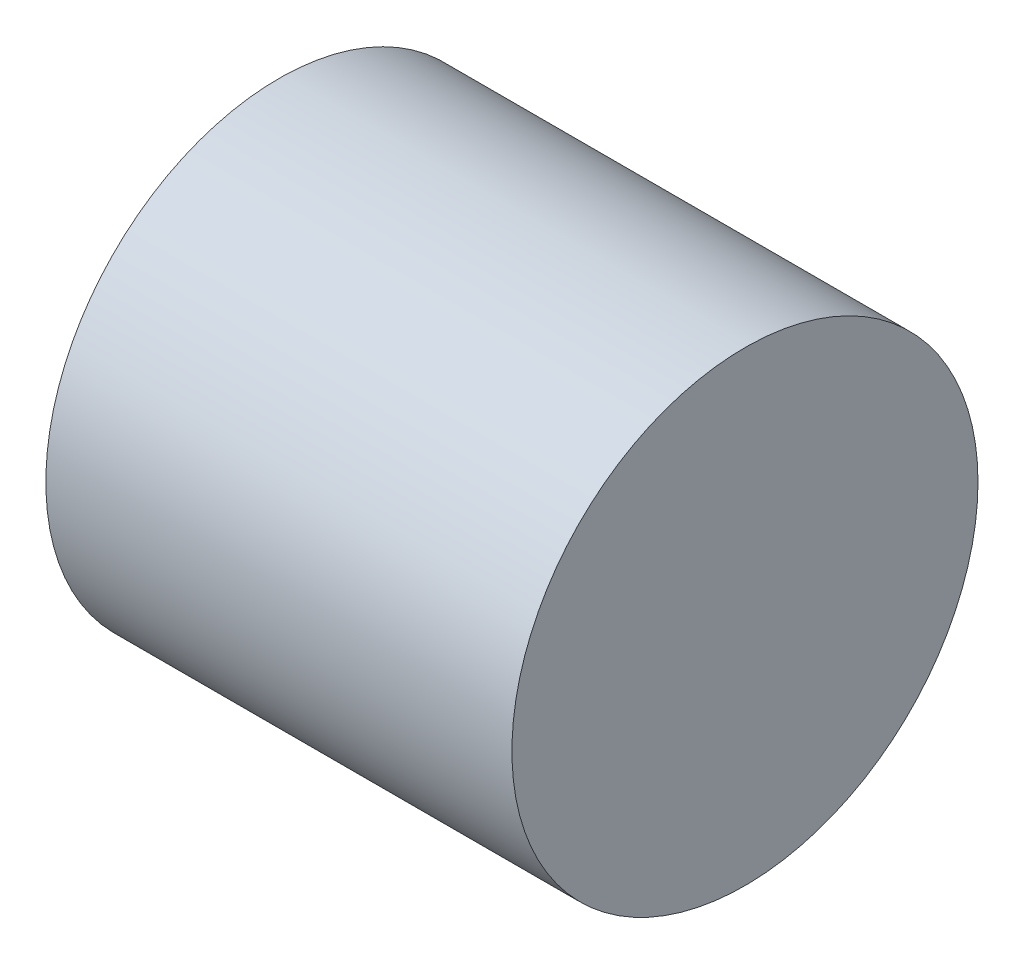
ISO-10303-21;
HEADER;
FILE_DESCRIPTION(('STEP AP214'),'2;1');
FILE_NAME('part.step','',(''),(''),'','','');
FILE_SCHEMA(('AUTOMOTIVE_DESIGN { 1 0 10303 214 1 1 1 1 }'));
ENDSEC;
DATA;
#1=APPLICATION_CONTEXT('core data for automotive mechanical design processes');
#2=APPLICATION_PROTOCOL_DEFINITION('international standard','automotive_design',2000,#1);
#3=PRODUCT_CONTEXT('',#1,'mechanical');
#4=PRODUCT('Part','Part','',(#3));
#5=PRODUCT_RELATED_PRODUCT_CATEGORY('part','',(#4));
#6=PRODUCT_DEFINITION_FORMATION('','',#4);
#7=PRODUCT_DEFINITION_CONTEXT('part definition',#1,'design');
#8=PRODUCT_DEFINITION('design','',#6,#7);
#9=PRODUCT_DEFINITION_SHAPE('','',#8);
#10=(LENGTH_UNIT() NAMED_UNIT(*) SI_UNIT(.MILLI.,.METRE.));
#11=(NAMED_UNIT(*) PLANE_ANGLE_UNIT() SI_UNIT($,.RADIAN.));
#12=(NAMED_UNIT(*) SI_UNIT($,.STERADIAN.) SOLID_ANGLE_UNIT());
#13=UNCERTAINTY_MEASURE_WITH_UNIT(LENGTH_MEASURE(1.E-05),#10,'distance_accuracy_value','');
#14=(GEOMETRIC_REPRESENTATION_CONTEXT(3) GLOBAL_UNCERTAINTY_ASSIGNED_CONTEXT((#13)) GLOBAL_UNIT_ASSIGNED_CONTEXT((#10,
#11,#12)) REPRESENTATION_CONTEXT('',''));
#15=CARTESIAN_POINT('',(0.,0.,0.));
#16=DIRECTION('',(0.,0.,1.));
#17=DIRECTION('',(1.,0.,0.));
#18=AXIS2_PLACEMENT_3D('',#15,#16,#17);
#19=CARTESIAN_POINT('',(15.,0.,0.));
#20=DIRECTION('',(-1.,0.,0.));
#21=DIRECTION('',(0.,0.,1.));
#22=AXIS2_PLACEMENT_3D('',#19,#20,#21);
#23=CYLINDRICAL_SURFACE('',#22,7.5);
#24=CARTESIAN_POINT('',(15.,0.,0.));
#25=DIRECTION('',(1.,0.,0.));
#26=DIRECTION('',(0.,0.,-1.));
#27=AXIS2_PLACEMENT_3D('',#24,#25,#26);
#28=CIRCLE('',#27,7.5);
#29=CARTESIAN_POINT('',(15.,0.,-7.5));
#30=VERTEX_POINT('',#29);
#31=EDGE_CURVE('E10',#30,#30,#28,.T.);
#32=ORIENTED_EDGE('',*,*,#31,.F.);
#33=EDGE_LOOP('',(#32));
#34=FACE_BOUND('',#33,.T.);
#35=CARTESIAN_POINT('',(0.,0.,0.));
#36=DIRECTION('',(1.,0.,0.));
#37=DIRECTION('',(0.,0.,-1.));
#38=AXIS2_PLACEMENT_3D('',#35,#36,#37);
#39=CIRCLE('',#38,7.5);
#40=CARTESIAN_POINT('',(0.,0.,-7.5));
#41=VERTEX_POINT('',#40);
#42=EDGE_CURVE('E34',#41,#41,#39,.T.);
#43=ORIENTED_EDGE('',*,*,#42,.T.);
#44=EDGE_LOOP('',(#43));
#45=FACE_BOUND('',#44,.T.);
#46=ADVANCED_FACE('F31',(#34,#45),#23,.T.);
#47=CARTESIAN_POINT('',(15.,0.,0.));
#48=DIRECTION('',(1.,0.,0.));
#49=DIRECTION('',(0.,0.,-1.));
#50=AXIS2_PLACEMENT_3D('',#47,#48,#49);
#51=PLANE('',#50);
#52=ORIENTED_EDGE('',*,*,#31,.T.);
#53=EDGE_LOOP('',(#52));
#54=FACE_BOUND('',#53,.T.);
#55=ADVANCED_FACE('F46',(#54),#51,.T.);
#56=CARTESIAN_POINT('',(0.,0.,0.));
#57=DIRECTION('',(1.,0.,0.));
#58=DIRECTION('',(0.,0.,-1.));
#59=AXIS2_PLACEMENT_3D('',#56,#57,#58);
#60=PLANE('',#59);
#61=ORIENTED_EDGE('',*,*,#42,.F.);
#62=EDGE_LOOP('',(#61));
#63=FACE_BOUND('',#62,.T.);
#64=ADVANCED_FACE('F44',(#63),#60,.F.);
#65=CLOSED_SHELL('',(#46,#55,#64));
#66=MANIFOLD_SOLID_BREP('B2',#65);
#67=ADVANCED_BREP_SHAPE_REPRESENTATION('',(#18,#66),#14);
#68=SHAPE_DEFINITION_REPRESENTATION(#9,#67);
ENDSEC;
END-ISO-10303-21;
